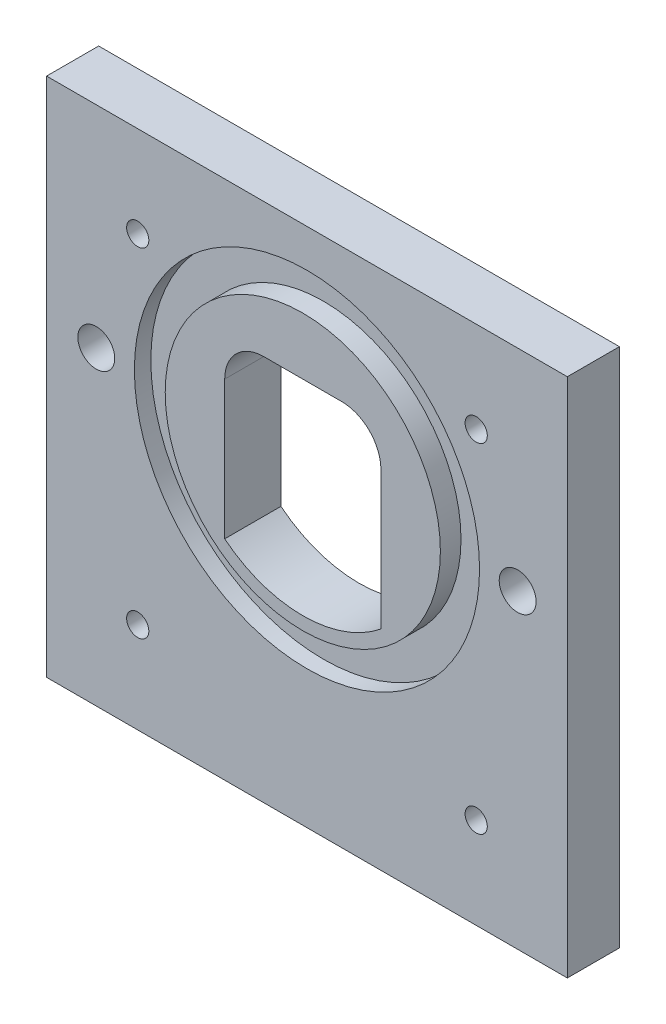
ISO-10303-21;
HEADER;
FILE_DESCRIPTION(('STEP AP214'),'2;1');
FILE_NAME('part.step','',(''),(''),'','','');
FILE_SCHEMA(('AUTOMOTIVE_DESIGN { 1 0 10303 214 1 1 1 1 }'));
ENDSEC;
DATA;
#1=APPLICATION_CONTEXT('core data for automotive mechanical design processes');
#2=APPLICATION_PROTOCOL_DEFINITION('international standard','automotive_design',2000,#1);
#3=PRODUCT_CONTEXT('',#1,'mechanical');
#4=PRODUCT('Part','Part','',(#3));
#5=PRODUCT_RELATED_PRODUCT_CATEGORY('part','',(#4));
#6=PRODUCT_DEFINITION_FORMATION('','',#4);
#7=PRODUCT_DEFINITION_CONTEXT('part definition',#1,'design');
#8=PRODUCT_DEFINITION('design','',#6,#7);
#9=PRODUCT_DEFINITION_SHAPE('','',#8);
#10=(LENGTH_UNIT() NAMED_UNIT(*) SI_UNIT(.MILLI.,.METRE.));
#11=(NAMED_UNIT(*) PLANE_ANGLE_UNIT() SI_UNIT($,.RADIAN.));
#12=(NAMED_UNIT(*) SI_UNIT($,.STERADIAN.) SOLID_ANGLE_UNIT());
#13=UNCERTAINTY_MEASURE_WITH_UNIT(LENGTH_MEASURE(1.E-05),#10,'distance_accuracy_value','');
#14=(GEOMETRIC_REPRESENTATION_CONTEXT(3) GLOBAL_UNCERTAINTY_ASSIGNED_CONTEXT((#13)) GLOBAL_UNIT_ASSIGNED_CONTEXT((#10,
#11,#12)) REPRESENTATION_CONTEXT('',''));
#15=CARTESIAN_POINT('',(0.,0.,0.));
#16=DIRECTION('',(0.,0.,1.));
#17=DIRECTION('',(1.,0.,0.));
#18=AXIS2_PLACEMENT_3D('',#15,#16,#17);
#19=CARTESIAN_POINT('',(31.75,-31.75,6.35));
#20=DIRECTION('',(-1.,0.,0.));
#21=DIRECTION('',(0.,0.,1.));
#22=AXIS2_PLACEMENT_3D('',#19,#20,#21);
#23=PLANE('',#22);
#24=DIRECTION('',(0.,1.,0.));
#25=VECTOR('',#24,1.);
#26=CARTESIAN_POINT('',(31.75,-31.75,0.));
#27=LINE('',#26,#25);
#28=CARTESIAN_POINT('',(31.75,-31.75,0.));
#29=VERTEX_POINT('',#28);
#30=CARTESIAN_POINT('',(31.75,31.75,0.));
#31=VERTEX_POINT('',#30);
#32=EDGE_CURVE('E212',#29,#31,#27,.T.);
#33=ORIENTED_EDGE('',*,*,#32,.T.);
#34=DIRECTION('',(0.,0.,-1.));
#35=VECTOR('',#34,1.);
#36=CARTESIAN_POINT('',(31.75,31.75,6.35));
#37=LINE('',#36,#35);
#38=CARTESIAN_POINT('',(31.75,31.75,6.35));
#39=VERTEX_POINT('',#38);
#40=EDGE_CURVE('E11',#39,#31,#37,.T.);
#41=ORIENTED_EDGE('',*,*,#40,.F.);
#42=DIRECTION('',(0.,1.,0.));
#43=VECTOR('',#42,1.);
#44=CARTESIAN_POINT('',(31.75,-31.75,6.35));
#45=LINE('',#44,#43);
#46=CARTESIAN_POINT('',(31.75,-31.75,6.35));
#47=VERTEX_POINT('',#46);
#48=EDGE_CURVE('E213',#47,#39,#45,.T.);
#49=ORIENTED_EDGE('',*,*,#48,.F.);
#50=DIRECTION('',(0.,0.,-1.));
#51=VECTOR('',#50,1.);
#52=CARTESIAN_POINT('',(31.75,-31.75,6.35));
#53=LINE('',#52,#51);
#54=EDGE_CURVE('E223',#47,#29,#53,.T.);
#55=ORIENTED_EDGE('',*,*,#54,.T.);
#56=EDGE_LOOP('',(#33,#41,#49,#55));
#57=FACE_BOUND('',#56,.T.);
#58=ADVANCED_FACE('F33',(#57),#23,.F.);
#59=CARTESIAN_POINT('',(-31.75,31.75,6.35));
#60=DIRECTION('',(0.,-1.,0.));
#61=DIRECTION('',(0.,0.,-1.));
#62=AXIS2_PLACEMENT_3D('',#59,#60,#61);
#63=PLANE('',#62);
#64=DIRECTION('',(-1.,0.,0.));
#65=VECTOR('',#64,1.);
#66=CARTESIAN_POINT('',(-31.75,31.75,0.));
#67=LINE('',#66,#65);
#68=CARTESIAN_POINT('',(-31.75,31.75,0.));
#69=VERTEX_POINT('',#68);
#70=EDGE_CURVE('E226',#31,#69,#67,.T.);
#71=ORIENTED_EDGE('',*,*,#70,.T.);
#72=DIRECTION('',(0.,0.,-1.));
#73=VECTOR('',#72,1.);
#74=CARTESIAN_POINT('',(-31.75,31.75,6.35));
#75=LINE('',#74,#73);
#76=CARTESIAN_POINT('',(-31.75,31.75,6.35));
#77=VERTEX_POINT('',#76);
#78=EDGE_CURVE('E41',#77,#69,#75,.T.);
#79=ORIENTED_EDGE('',*,*,#78,.F.);
#80=DIRECTION('',(-1.,0.,0.));
#81=VECTOR('',#80,1.);
#82=CARTESIAN_POINT('',(-31.75,31.75,6.35));
#83=LINE('',#82,#81);
#84=EDGE_CURVE('E216',#39,#77,#83,.T.);
#85=ORIENTED_EDGE('',*,*,#84,.F.);
#86=ORIENTED_EDGE('',*,*,#40,.T.);
#87=EDGE_LOOP('',(#71,#79,#85,#86));
#88=FACE_BOUND('',#87,.T.);
#89=ADVANCED_FACE('F258',(#88),#63,.F.);
#90=CARTESIAN_POINT('',(-31.75,-31.75,6.35));
#91=DIRECTION('',(1.,0.,0.));
#92=DIRECTION('',(0.,0.,-1.));
#93=AXIS2_PLACEMENT_3D('',#90,#91,#92);
#94=PLANE('',#93);
#95=DIRECTION('',(0.,-1.,0.));
#96=VECTOR('',#95,1.);
#97=CARTESIAN_POINT('',(-31.75,-31.75,0.));
#98=LINE('',#97,#96);
#99=CARTESIAN_POINT('',(-31.75,-31.75,0.));
#100=VERTEX_POINT('',#99);
#101=EDGE_CURVE('E228',#69,#100,#98,.T.);
#102=ORIENTED_EDGE('',*,*,#101,.T.);
#103=DIRECTION('',(0.,0.,-1.));
#104=VECTOR('',#103,1.);
#105=CARTESIAN_POINT('',(-31.75,-31.75,6.35));
#106=LINE('',#105,#104);
#107=CARTESIAN_POINT('',(-31.75,-31.75,6.35));
#108=VERTEX_POINT('',#107);
#109=EDGE_CURVE('E233',#108,#100,#106,.T.);
#110=ORIENTED_EDGE('',*,*,#109,.F.);
#111=DIRECTION('',(0.,-1.,0.));
#112=VECTOR('',#111,1.);
#113=CARTESIAN_POINT('',(-31.75,-31.75,6.35));
#114=LINE('',#113,#112);
#115=EDGE_CURVE('E219',#77,#108,#114,.T.);
#116=ORIENTED_EDGE('',*,*,#115,.F.);
#117=ORIENTED_EDGE('',*,*,#78,.T.);
#118=EDGE_LOOP('',(#102,#110,#116,#117));
#119=FACE_BOUND('',#118,.T.);
#120=ADVANCED_FACE('F263',(#119),#94,.F.);
#121=CARTESIAN_POINT('',(-31.75,-31.75,6.35));
#122=DIRECTION('',(0.,1.,0.));
#123=DIRECTION('',(0.,0.,1.));
#124=AXIS2_PLACEMENT_3D('',#121,#122,#123);
#125=PLANE('',#124);
#126=DIRECTION('',(1.,0.,0.));
#127=VECTOR('',#126,1.);
#128=CARTESIAN_POINT('',(-31.75,-31.75,0.));
#129=LINE('',#128,#127);
#130=EDGE_CURVE('E217',#100,#29,#129,.T.);
#131=ORIENTED_EDGE('',*,*,#130,.T.);
#132=ORIENTED_EDGE('',*,*,#54,.F.);
#133=DIRECTION('',(1.,0.,0.));
#134=VECTOR('',#133,1.);
#135=CARTESIAN_POINT('',(-31.75,-31.75,6.35));
#136=LINE('',#135,#134);
#137=EDGE_CURVE('E221',#108,#47,#136,.T.);
#138=ORIENTED_EDGE('',*,*,#137,.F.);
#139=ORIENTED_EDGE('',*,*,#109,.T.);
#140=EDGE_LOOP('',(#131,#132,#138,#139));
#141=FACE_BOUND('',#140,.T.);
#142=ADVANCED_FACE('F279',(#141),#125,.F.);
#143=CARTESIAN_POINT('',(31.75,31.75,6.35));
#144=DIRECTION('',(0.,0.,-1.));
#145=DIRECTION('',(-1.,0.,0.));
#146=AXIS2_PLACEMENT_3D('',#143,#144,#145);
#147=PLANE('',#146);
#148=CARTESIAN_POINT('',(25.6911768305445,6.07686515337297,6.35));
#149=DIRECTION('',(0.,0.,-1.));
#150=DIRECTION('',(-1.,0.,0.));
#151=AXIS2_PLACEMENT_3D('',#148,#149,#150);
#152=CIRCLE('',#151,2.25);
#153=CARTESIAN_POINT('',(23.4411768305445,6.07686515337297,6.35));
#154=VERTEX_POINT('',#153);
#155=EDGE_CURVE('E36',#154,#154,#152,.T.);
#156=ORIENTED_EDGE('',*,*,#155,.T.);
#157=EDGE_LOOP('',(#156));
#158=FACE_BOUND('',#157,.T.);
#159=CARTESIAN_POINT('',(-25.6911768305436,6.07686515337297,6.35));
#160=DIRECTION('',(0.,0.,-1.));
#161=DIRECTION('',(-1.,0.,0.));
#162=AXIS2_PLACEMENT_3D('',#159,#160,#161);
#163=CIRCLE('',#162,2.25);
#164=CARTESIAN_POINT('',(-27.9411768305436,6.07686515337297,6.35));
#165=VERTEX_POINT('',#164);
#166=EDGE_CURVE('E175',#165,#165,#163,.T.);
#167=ORIENTED_EDGE('',*,*,#166,.T.);
#168=EDGE_LOOP('',(#167));
#169=FACE_BOUND('',#168,.T.);
#170=CARTESIAN_POINT('',(1.67183974997265E-13,6.07686515337297,6.35));
#171=DIRECTION('',(0.,0.,1.));
#172=DIRECTION('',(1.,0.,0.));
#173=AXIS2_PLACEMENT_3D('',#170,#171,#172);
#174=CIRCLE('',#173,21.0439);
#175=CARTESIAN_POINT('',(21.0439000000002,6.07686515337297,6.35));
#176=VERTEX_POINT('',#175);
#177=EDGE_CURVE('E182',#176,#176,#174,.T.);
#178=ORIENTED_EDGE('',*,*,#177,.F.);
#179=EDGE_LOOP('',(#178));
#180=FACE_BOUND('',#179,.T.);
#181=CARTESIAN_POINT('',(-20.6375,-20.6375,6.35));
#182=DIRECTION('',(0.,0.,-1.));
#183=DIRECTION('',(-1.,0.,0.));
#184=AXIS2_PLACEMENT_3D('',#181,#182,#183);
#185=CIRCLE('',#184,1.35255);
#186=CARTESIAN_POINT('',(-21.99005,-20.6375,6.35));
#187=VERTEX_POINT('',#186);
#188=EDGE_CURVE('E191',#187,#187,#185,.T.);
#189=ORIENTED_EDGE('',*,*,#188,.T.);
#190=EDGE_LOOP('',(#189));
#191=FACE_BOUND('',#190,.T.);
#192=CARTESIAN_POINT('',(20.6375,-20.6375,6.35));
#193=DIRECTION('',(0.,0.,-1.));
#194=DIRECTION('',(-1.,0.,0.));
#195=AXIS2_PLACEMENT_3D('',#192,#193,#194);
#196=CIRCLE('',#195,1.35255);
#197=CARTESIAN_POINT('',(19.28495,-20.6375,6.35));
#198=VERTEX_POINT('',#197);
#199=EDGE_CURVE('E197',#198,#198,#196,.T.);
#200=ORIENTED_EDGE('',*,*,#199,.T.);
#201=EDGE_LOOP('',(#200));
#202=FACE_BOUND('',#201,.T.);
#203=CARTESIAN_POINT('',(20.6375,20.6375,6.35));
#204=DIRECTION('',(0.,0.,-1.));
#205=DIRECTION('',(-1.,0.,0.));
#206=AXIS2_PLACEMENT_3D('',#203,#204,#205);
#207=CIRCLE('',#206,1.35255);
#208=CARTESIAN_POINT('',(19.28495,20.6375,6.35));
#209=VERTEX_POINT('',#208);
#210=EDGE_CURVE('E203',#209,#209,#207,.T.);
#211=ORIENTED_EDGE('',*,*,#210,.T.);
#212=EDGE_LOOP('',(#211));
#213=FACE_BOUND('',#212,.T.);
#214=CARTESIAN_POINT('',(-20.6375,20.6375,6.35));
#215=DIRECTION('',(0.,0.,-1.));
#216=DIRECTION('',(-1.,0.,0.));
#217=AXIS2_PLACEMENT_3D('',#214,#215,#216);
#218=CIRCLE('',#217,1.35255);
#219=CARTESIAN_POINT('',(-21.99005,20.6375,6.35));
#220=VERTEX_POINT('',#219);
#221=EDGE_CURVE('E209',#220,#220,#218,.T.);
#222=ORIENTED_EDGE('',*,*,#221,.T.);
#223=EDGE_LOOP('',(#222));
#224=FACE_BOUND('',#223,.T.);
#225=ORIENTED_EDGE('',*,*,#48,.T.);
#226=ORIENTED_EDGE('',*,*,#84,.T.);
#227=ORIENTED_EDGE('',*,*,#115,.T.);
#228=ORIENTED_EDGE('',*,*,#137,.T.);
#229=EDGE_LOOP('',(#225,#226,#227,#228));
#230=FACE_BOUND('',#229,.T.);
#231=ADVANCED_FACE('F240',(#158,#169,#180,#191,#202,#213,#224,#230),#147,.F.);
#232=CARTESIAN_POINT('',(31.75,31.75,0.));
#233=DIRECTION('',(0.,0.,-1.));
#234=DIRECTION('',(-1.,0.,0.));
#235=AXIS2_PLACEMENT_3D('',#232,#233,#234);
#236=PLANE('',#235);
#237=CARTESIAN_POINT('',(-4.7625,11.1125,0.));
#238=DIRECTION('',(0.,0.,-1.));
#239=DIRECTION('',(-1.,0.,0.));
#240=AXIS2_PLACEMENT_3D('',#237,#238,#239);
#241=CIRCLE('',#240,4.7625);
#242=CARTESIAN_POINT('',(-9.525,11.1125,0.));
#243=VERTEX_POINT('',#242);
#244=CARTESIAN_POINT('',(-4.7625,15.875,0.));
#245=VERTEX_POINT('',#244);
#246=EDGE_CURVE('E49',#243,#245,#241,.T.);
#247=ORIENTED_EDGE('',*,*,#246,.F.);
#248=DIRECTION('',(0.,1.,0.));
#249=VECTOR('',#248,1.);
#250=CARTESIAN_POINT('',(-9.525,11.1125,0.));
#251=LINE('',#250,#249);
#252=CARTESIAN_POINT('',(-9.525,-5.75471004353972,0.));
#253=VERTEX_POINT('',#252);
#254=EDGE_CURVE('E130',#253,#243,#251,.T.);
#255=ORIENTED_EDGE('',*,*,#254,.F.);
#256=CARTESIAN_POINT('',(0.,6.07686515337317,0.));
#257=DIRECTION('',(0.,0.,-1.));
#258=DIRECTION('',(-1.,0.,0.));
#259=AXIS2_PLACEMENT_3D('',#256,#257,#258);
#260=CIRCLE('',#259,15.1892000000067);
#261=CARTESIAN_POINT('',(9.525,-5.75471004353972,0.));
#262=VERTEX_POINT('',#261);
#263=EDGE_CURVE('E133',#262,#253,#260,.T.);
#264=ORIENTED_EDGE('',*,*,#263,.F.);
#265=DIRECTION('',(0.,-1.,0.));
#266=VECTOR('',#265,1.);
#267=CARTESIAN_POINT('',(9.525,11.1125,0.));
#268=LINE('',#267,#266);
#269=CARTESIAN_POINT('',(9.525,11.1125,0.));
#270=VERTEX_POINT('',#269);
#271=EDGE_CURVE('E149',#270,#262,#268,.T.);
#272=ORIENTED_EDGE('',*,*,#271,.F.);
#273=CARTESIAN_POINT('',(4.7625,11.1125,0.));
#274=DIRECTION('',(0.,0.,-1.));
#275=DIRECTION('',(1.,0.,0.));
#276=AXIS2_PLACEMENT_3D('',#273,#274,#275);
#277=CIRCLE('',#276,4.7625);
#278=CARTESIAN_POINT('',(4.7625,15.875,0.));
#279=VERTEX_POINT('',#278);
#280=EDGE_CURVE('E146',#279,#270,#277,.T.);
#281=ORIENTED_EDGE('',*,*,#280,.F.);
#282=DIRECTION('',(1.,0.,0.));
#283=VECTOR('',#282,1.);
#284=CARTESIAN_POINT('',(-4.7625,15.875,0.));
#285=LINE('',#284,#283);
#286=EDGE_CURVE('E144',#245,#279,#285,.T.);
#287=ORIENTED_EDGE('',*,*,#286,.F.);
#288=EDGE_LOOP('',(#247,#255,#264,#272,#281,#287));
#289=FACE_BOUND('',#288,.T.);
#290=CARTESIAN_POINT('',(25.6911768305445,6.07686515337297,0.));
#291=DIRECTION('',(0.,0.,-1.));
#292=DIRECTION('',(-1.,0.,0.));
#293=AXIS2_PLACEMENT_3D('',#290,#291,#292);
#294=CIRCLE('',#293,4.7);
#295=CARTESIAN_POINT('',(20.9911768305445,6.07686515337297,0.));
#296=VERTEX_POINT('',#295);
#297=EDGE_CURVE('E156',#296,#296,#294,.T.);
#298=ORIENTED_EDGE('',*,*,#297,.F.);
#299=EDGE_LOOP('',(#298));
#300=FACE_BOUND('',#299,.T.);
#301=CARTESIAN_POINT('',(-25.6911768305436,6.07686515337297,0.));
#302=DIRECTION('',(0.,0.,-1.));
#303=DIRECTION('',(-1.,0.,0.));
#304=AXIS2_PLACEMENT_3D('',#301,#302,#303);
#305=CIRCLE('',#304,4.7);
#306=CARTESIAN_POINT('',(-30.3911768305436,6.07686515337297,0.));
#307=VERTEX_POINT('',#306);
#308=EDGE_CURVE('E169',#307,#307,#305,.T.);
#309=ORIENTED_EDGE('',*,*,#308,.F.);
#310=EDGE_LOOP('',(#309));
#311=FACE_BOUND('',#310,.T.);
#312=CARTESIAN_POINT('',(-20.6375,-20.6375,0.));
#313=DIRECTION('',(0.,0.,-1.));
#314=DIRECTION('',(-1.,0.,0.));
#315=AXIS2_PLACEMENT_3D('',#312,#313,#314);
#316=CIRCLE('',#315,1.35254999999999);
#317=CARTESIAN_POINT('',(-21.99005,-20.6375,0.));
#318=VERTEX_POINT('',#317);
#319=EDGE_CURVE('E186',#318,#318,#316,.T.);
#320=ORIENTED_EDGE('',*,*,#319,.F.);
#321=EDGE_LOOP('',(#320));
#322=FACE_BOUND('',#321,.T.);
#323=CARTESIAN_POINT('',(20.6375,-20.6375,0.));
#324=DIRECTION('',(0.,0.,-1.));
#325=DIRECTION('',(-1.,0.,0.));
#326=AXIS2_PLACEMENT_3D('',#323,#324,#325);
#327=CIRCLE('',#326,1.35254999999999);
#328=CARTESIAN_POINT('',(19.28495,-20.6375,0.));
#329=VERTEX_POINT('',#328);
#330=EDGE_CURVE('E194',#329,#329,#327,.T.);
#331=ORIENTED_EDGE('',*,*,#330,.F.);
#332=EDGE_LOOP('',(#331));
#333=FACE_BOUND('',#332,.T.);
#334=CARTESIAN_POINT('',(20.6375,20.6375,0.));
#335=DIRECTION('',(0.,0.,-1.));
#336=DIRECTION('',(-1.,0.,0.));
#337=AXIS2_PLACEMENT_3D('',#334,#335,#336);
#338=CIRCLE('',#337,1.35254999999999);
#339=CARTESIAN_POINT('',(19.28495,20.6375,0.));
#340=VERTEX_POINT('',#339);
#341=EDGE_CURVE('E200',#340,#340,#338,.T.);
#342=ORIENTED_EDGE('',*,*,#341,.F.);
#343=EDGE_LOOP('',(#342));
#344=FACE_BOUND('',#343,.T.);
#345=CARTESIAN_POINT('',(-20.6375,20.6375,0.));
#346=DIRECTION('',(0.,0.,-1.));
#347=DIRECTION('',(-1.,0.,0.));
#348=AXIS2_PLACEMENT_3D('',#345,#346,#347);
#349=CIRCLE('',#348,1.35254999999999);
#350=CARTESIAN_POINT('',(-21.99005,20.6375,0.));
#351=VERTEX_POINT('',#350);
#352=EDGE_CURVE('E206',#351,#351,#349,.T.);
#353=ORIENTED_EDGE('',*,*,#352,.F.);
#354=EDGE_LOOP('',(#353));
#355=FACE_BOUND('',#354,.T.);
#356=ORIENTED_EDGE('',*,*,#32,.F.);
#357=ORIENTED_EDGE('',*,*,#130,.F.);
#358=ORIENTED_EDGE('',*,*,#101,.F.);
#359=ORIENTED_EDGE('',*,*,#70,.F.);
#360=EDGE_LOOP('',(#356,#357,#358,#359));
#361=FACE_BOUND('',#360,.T.);
#362=ADVANCED_FACE('F271',(#289,#300,#311,#322,#333,#344,#355,#361),#236,.T.);
#363=CARTESIAN_POINT('',(-20.6375,20.6375,0.));
#364=DIRECTION('',(0.,0.,-1.));
#365=DIRECTION('',(-1.,0.,0.));
#366=AXIS2_PLACEMENT_3D('',#363,#364,#365);
#367=CYLINDRICAL_SURFACE('',#366,1.35254999999999);
#368=ORIENTED_EDGE('',*,*,#221,.F.);
#369=EDGE_LOOP('',(#368));
#370=FACE_BOUND('',#369,.T.);
#371=ORIENTED_EDGE('',*,*,#352,.T.);
#372=EDGE_LOOP('',(#371));
#373=FACE_BOUND('',#372,.T.);
#374=ADVANCED_FACE('F290',(#370,#373),#367,.F.);
#375=CARTESIAN_POINT('',(20.6375,20.6375,0.));
#376=DIRECTION('',(0.,0.,-1.));
#377=DIRECTION('',(-1.,0.,0.));
#378=AXIS2_PLACEMENT_3D('',#375,#376,#377);
#379=CYLINDRICAL_SURFACE('',#378,1.35254999999999);
#380=ORIENTED_EDGE('',*,*,#210,.F.);
#381=EDGE_LOOP('',(#380));
#382=FACE_BOUND('',#381,.T.);
#383=ORIENTED_EDGE('',*,*,#341,.T.);
#384=EDGE_LOOP('',(#383));
#385=FACE_BOUND('',#384,.T.);
#386=ADVANCED_FACE('F297',(#382,#385),#379,.F.);
#387=CARTESIAN_POINT('',(20.6375,-20.6375,0.));
#388=DIRECTION('',(0.,0.,-1.));
#389=DIRECTION('',(-1.,0.,0.));
#390=AXIS2_PLACEMENT_3D('',#387,#388,#389);
#391=CYLINDRICAL_SURFACE('',#390,1.35254999999999);
#392=ORIENTED_EDGE('',*,*,#199,.F.);
#393=EDGE_LOOP('',(#392));
#394=FACE_BOUND('',#393,.T.);
#395=ORIENTED_EDGE('',*,*,#330,.T.);
#396=EDGE_LOOP('',(#395));
#397=FACE_BOUND('',#396,.T.);
#398=ADVANCED_FACE('F301',(#394,#397),#391,.F.);
#399=CARTESIAN_POINT('',(-20.6375,-20.6375,0.));
#400=DIRECTION('',(0.,0.,-1.));
#401=DIRECTION('',(-1.,0.,0.));
#402=AXIS2_PLACEMENT_3D('',#399,#400,#401);
#403=CYLINDRICAL_SURFACE('',#402,1.35254999999999);
#404=ORIENTED_EDGE('',*,*,#188,.F.);
#405=EDGE_LOOP('',(#404));
#406=FACE_BOUND('',#405,.T.);
#407=ORIENTED_EDGE('',*,*,#319,.T.);
#408=EDGE_LOOP('',(#407));
#409=FACE_BOUND('',#408,.T.);
#410=ADVANCED_FACE('F305',(#406,#409),#403,.F.);
#411=CARTESIAN_POINT('',(1.67183974997265E-13,6.07686515337297,4.3434));
#412=DIRECTION('',(0.,0.,1.));
#413=DIRECTION('',(1.,0.,0.));
#414=AXIS2_PLACEMENT_3D('',#411,#412,#413);
#415=CYLINDRICAL_SURFACE('',#414,21.0439);
#416=CARTESIAN_POINT('',(1.67183974997265E-13,6.07686515337297,4.3434));
#417=DIRECTION('',(0.,0.,1.));
#418=DIRECTION('',(1.,0.,0.));
#419=AXIS2_PLACEMENT_3D('',#416,#417,#418);
#420=CIRCLE('',#419,21.0439);
#421=CARTESIAN_POINT('',(21.0439000000002,6.07686515337297,4.3434));
#422=VERTEX_POINT('',#421);
#423=EDGE_CURVE('E183',#422,#422,#420,.T.);
#424=ORIENTED_EDGE('',*,*,#423,.F.);
#425=EDGE_LOOP('',(#424));
#426=FACE_BOUND('',#425,.T.);
#427=ORIENTED_EDGE('',*,*,#177,.T.);
#428=EDGE_LOOP('',(#427));
#429=FACE_BOUND('',#428,.T.);
#430=ADVANCED_FACE('F309',(#426,#429),#415,.F.);
#431=CARTESIAN_POINT('',(1.67183974997265E-13,6.07686515337297,4.3434));
#432=DIRECTION('',(0.,0.,1.));
#433=DIRECTION('',(1.,0.,0.));
#434=AXIS2_PLACEMENT_3D('',#431,#432,#433);
#435=PLANE('',#434);
#436=CARTESIAN_POINT('',(1.67183974997265E-13,6.07686515337297,4.3434));
#437=DIRECTION('',(0.,0.,1.));
#438=DIRECTION('',(1.,0.,0.));
#439=AXIS2_PLACEMENT_3D('',#436,#437,#438);
#440=CIRCLE('',#439,16.7767);
#441=CARTESIAN_POINT('',(16.7767000000002,6.07686515337297,4.3434));
#442=VERTEX_POINT('',#441);
#443=EDGE_CURVE('E179',#442,#442,#440,.T.);
#444=ORIENTED_EDGE('',*,*,#443,.F.);
#445=EDGE_LOOP('',(#444));
#446=FACE_BOUND('',#445,.T.);
#447=ORIENTED_EDGE('',*,*,#423,.T.);
#448=EDGE_LOOP('',(#447));
#449=FACE_BOUND('',#448,.T.);
#450=ADVANCED_FACE('F313',(#446,#449),#435,.T.);
#451=CARTESIAN_POINT('',(1.67183974997265E-13,6.07686515337297,4.3434));
#452=DIRECTION('',(0.,0.,1.));
#453=DIRECTION('',(1.,0.,0.));
#454=AXIS2_PLACEMENT_3D('',#451,#452,#453);
#455=CYLINDRICAL_SURFACE('',#454,16.7767);
#456=ORIENTED_EDGE('',*,*,#443,.T.);
#457=EDGE_LOOP('',(#456));
#458=FACE_BOUND('',#457,.T.);
#459=CARTESIAN_POINT('',(1.67183974997265E-13,6.07686515337297,6.858));
#460=DIRECTION('',(0.,0.,1.));
#461=DIRECTION('',(1.,0.,0.));
#462=AXIS2_PLACEMENT_3D('',#459,#460,#461);
#463=CIRCLE('',#462,16.7767000000067);
#464=CARTESIAN_POINT('',(16.7767000000068,6.07686515337297,6.858));
#465=VERTEX_POINT('',#464);
#466=EDGE_CURVE('E176',#465,#465,#463,.T.);
#467=ORIENTED_EDGE('',*,*,#466,.F.);
#468=EDGE_LOOP('',(#467));
#469=FACE_BOUND('',#468,.T.);
#470=ADVANCED_FACE('F255',(#458,#469),#455,.T.);
#471=CARTESIAN_POINT('',(1.67183974997265E-13,6.07686515337297,6.858));
#472=DIRECTION('',(0.,0.,1.));
#473=DIRECTION('',(1.,0.,0.));
#474=AXIS2_PLACEMENT_3D('',#471,#472,#473);
#475=PLANE('',#474);
#476=CARTESIAN_POINT('',(-4.7625,11.1125,6.858));
#477=DIRECTION('',(0.,0.,-1.));
#478=DIRECTION('',(-1.,0.,0.));
#479=AXIS2_PLACEMENT_3D('',#476,#477,#478);
#480=CIRCLE('',#479,4.7625);
#481=CARTESIAN_POINT('',(-9.525,11.1125,6.858));
#482=VERTEX_POINT('',#481);
#483=CARTESIAN_POINT('',(-4.7625,15.875,6.858));
#484=VERTEX_POINT('',#483);
#485=EDGE_CURVE('E113',#482,#484,#480,.T.);
#486=ORIENTED_EDGE('',*,*,#485,.T.);
#487=DIRECTION('',(1.,0.,0.));
#488=VECTOR('',#487,1.);
#489=CARTESIAN_POINT('',(-4.7625,15.875,6.858));
#490=LINE('',#489,#488);
#491=CARTESIAN_POINT('',(4.7625,15.875,6.858));
#492=VERTEX_POINT('',#491);
#493=EDGE_CURVE('E122',#484,#492,#490,.T.);
#494=ORIENTED_EDGE('',*,*,#493,.T.);
#495=CARTESIAN_POINT('',(4.7625,11.1125,6.858));
#496=DIRECTION('',(0.,0.,-1.));
#497=DIRECTION('',(1.,0.,0.));
#498=AXIS2_PLACEMENT_3D('',#495,#496,#497);
#499=CIRCLE('',#498,4.7625);
#500=CARTESIAN_POINT('',(9.525,11.1125,6.858));
#501=VERTEX_POINT('',#500);
#502=EDGE_CURVE('E57',#492,#501,#499,.T.);
#503=ORIENTED_EDGE('',*,*,#502,.T.);
#504=DIRECTION('',(0.,-1.,0.));
#505=VECTOR('',#504,1.);
#506=CARTESIAN_POINT('',(9.525,11.1125,6.858));
#507=LINE('',#506,#505);
#508=CARTESIAN_POINT('',(9.525,-5.75471004353972,6.858));
#509=VERTEX_POINT('',#508);
#510=EDGE_CURVE('E137',#501,#509,#507,.T.);
#511=ORIENTED_EDGE('',*,*,#510,.T.);
#512=CARTESIAN_POINT('',(0.,6.07686515337317,6.858));
#513=DIRECTION('',(0.,0.,-1.));
#514=DIRECTION('',(-1.,0.,0.));
#515=AXIS2_PLACEMENT_3D('',#512,#513,#514);
#516=CIRCLE('',#515,15.1892000000067);
#517=CARTESIAN_POINT('',(-9.525,-5.75471004353972,6.858));
#518=VERTEX_POINT('',#517);
#519=EDGE_CURVE('E140',#509,#518,#516,.T.);
#520=ORIENTED_EDGE('',*,*,#519,.T.);
#521=DIRECTION('',(0.,1.,0.));
#522=VECTOR('',#521,1.);
#523=CARTESIAN_POINT('',(-9.525,11.1125,6.858));
#524=LINE('',#523,#522);
#525=EDGE_CURVE('E119',#518,#482,#524,.T.);
#526=ORIENTED_EDGE('',*,*,#525,.T.);
#527=EDGE_LOOP('',(#486,#494,#503,#511,#520,#526));
#528=FACE_BOUND('',#527,.T.);
#529=ORIENTED_EDGE('',*,*,#466,.T.);
#530=EDGE_LOOP('',(#529));
#531=FACE_BOUND('',#530,.T.);
#532=ADVANCED_FACE('F126',(#528,#531),#475,.T.);
#533=CARTESIAN_POINT('',(-25.6911768305436,6.07686515337297,0.));
#534=DIRECTION('',(0.,0.,-1.));
#535=DIRECTION('',(-1.,0.,0.));
#536=AXIS2_PLACEMENT_3D('',#533,#534,#535);
#537=CYLINDRICAL_SURFACE('',#536,2.25);
#538=CARTESIAN_POINT('',(-25.6911768305436,6.07686515337297,2.45));
#539=DIRECTION('',(0.,0.,-1.));
#540=DIRECTION('',(-1.,0.,0.));
#541=AXIS2_PLACEMENT_3D('',#538,#539,#540);
#542=CIRCLE('',#541,2.25);
#543=CARTESIAN_POINT('',(-27.9411768305436,6.07686515337297,2.45));
#544=VERTEX_POINT('',#543);
#545=EDGE_CURVE('E172',#544,#544,#542,.T.);
#546=ORIENTED_EDGE('',*,*,#545,.T.);
#547=EDGE_LOOP('',(#546));
#548=FACE_BOUND('',#547,.T.);
#549=ORIENTED_EDGE('',*,*,#166,.F.);
#550=EDGE_LOOP('',(#549));
#551=FACE_BOUND('',#550,.T.);
#552=ADVANCED_FACE('F243',(#548,#551),#537,.F.);
#553=CARTESIAN_POINT('',(-25.6911768305436,6.07686515337297,0.));
#554=DIRECTION('',(0.,0.,-1.));
#555=DIRECTION('',(-1.,0.,0.));
#556=AXIS2_PLACEMENT_3D('',#553,#554,#555);
#557=CONICAL_SURFACE('',#556,4.7,0.785398163397448);
#558=ORIENTED_EDGE('',*,*,#545,.F.);
#559=EDGE_LOOP('',(#558));
#560=FACE_BOUND('',#559,.T.);
#561=ORIENTED_EDGE('',*,*,#308,.T.);
#562=EDGE_LOOP('',(#561));
#563=FACE_BOUND('',#562,.T.);
#564=ADVANCED_FACE('F245',(#560,#563),#557,.F.);
#565=CARTESIAN_POINT('',(25.6911768305445,6.07686515337297,0.));
#566=DIRECTION('',(0.,0.,-1.));
#567=DIRECTION('',(-1.,0.,0.));
#568=AXIS2_PLACEMENT_3D('',#565,#566,#567);
#569=CYLINDRICAL_SURFACE('',#568,2.25);
#570=CARTESIAN_POINT('',(25.6911768305445,6.07686515337297,2.45));
#571=DIRECTION('',(0.,0.,-1.));
#572=DIRECTION('',(-1.,0.,0.));
#573=AXIS2_PLACEMENT_3D('',#570,#571,#572);
#574=CIRCLE('',#573,2.25);
#575=CARTESIAN_POINT('',(23.4411768305445,6.07686515337297,2.45));
#576=VERTEX_POINT('',#575);
#577=EDGE_CURVE('E166',#576,#576,#574,.T.);
#578=ORIENTED_EDGE('',*,*,#577,.T.);
#579=EDGE_LOOP('',(#578));
#580=FACE_BOUND('',#579,.T.);
#581=ORIENTED_EDGE('',*,*,#155,.F.);
#582=EDGE_LOOP('',(#581));
#583=FACE_BOUND('',#582,.T.);
#584=ADVANCED_FACE('F252',(#580,#583),#569,.F.);
#585=CARTESIAN_POINT('',(25.6911768305445,6.07686515337297,0.));
#586=DIRECTION('',(0.,0.,-1.));
#587=DIRECTION('',(-1.,0.,0.));
#588=AXIS2_PLACEMENT_3D('',#585,#586,#587);
#589=CONICAL_SURFACE('',#588,4.7,0.785398163397448);
#590=ORIENTED_EDGE('',*,*,#577,.F.);
#591=EDGE_LOOP('',(#590));
#592=FACE_BOUND('',#591,.T.);
#593=ORIENTED_EDGE('',*,*,#297,.T.);
#594=EDGE_LOOP('',(#593));
#595=FACE_BOUND('',#594,.T.);
#596=ADVANCED_FACE('F369',(#592,#595),#589,.F.);
#597=CARTESIAN_POINT('',(-4.7625,11.1125,6.858));
#598=DIRECTION('',(0.,0.,-1.));
#599=DIRECTION('',(-1.,0.,0.));
#600=AXIS2_PLACEMENT_3D('',#597,#598,#599);
#601=CYLINDRICAL_SURFACE('',#600,4.7625);
#602=ORIENTED_EDGE('',*,*,#246,.T.);
#603=DIRECTION('',(0.,0.,-1.));
#604=VECTOR('',#603,1.);
#605=CARTESIAN_POINT('',(-4.7625,15.875,6.858));
#606=LINE('',#605,#604);
#607=EDGE_CURVE('E109',#484,#245,#606,.T.);
#608=ORIENTED_EDGE('',*,*,#607,.F.);
#609=ORIENTED_EDGE('',*,*,#485,.F.);
#610=DIRECTION('',(0.,0.,-1.));
#611=VECTOR('',#610,1.);
#612=CARTESIAN_POINT('',(-9.525,11.1125,6.858));
#613=LINE('',#612,#611);
#614=EDGE_CURVE('E154',#482,#243,#613,.T.);
#615=ORIENTED_EDGE('',*,*,#614,.T.);
#616=EDGE_LOOP('',(#602,#608,#609,#615));
#617=FACE_BOUND('',#616,.T.);
#618=ADVANCED_FACE('F111',(#617),#601,.F.);
#619=CARTESIAN_POINT('',(-9.525,11.1125,6.858));
#620=DIRECTION('',(-1.,0.,0.));
#621=DIRECTION('',(0.,-1.,0.));
#622=AXIS2_PLACEMENT_3D('',#619,#620,#621);
#623=PLANE('',#622);
#624=ORIENTED_EDGE('',*,*,#254,.T.);
#625=ORIENTED_EDGE('',*,*,#614,.F.);
#626=ORIENTED_EDGE('',*,*,#525,.F.);
#627=DIRECTION('',(0.,0.,-1.));
#628=VECTOR('',#627,1.);
#629=CARTESIAN_POINT('',(-9.525,-5.75471004353972,6.858));
#630=LINE('',#629,#628);
#631=EDGE_CURVE('E157',#518,#253,#630,.T.);
#632=ORIENTED_EDGE('',*,*,#631,.T.);
#633=EDGE_LOOP('',(#624,#625,#626,#632));
#634=FACE_BOUND('',#633,.T.);
#635=ADVANCED_FACE('F368',(#634),#623,.F.);
#636=CARTESIAN_POINT('',(0.,6.07686515337317,6.858));
#637=DIRECTION('',(0.,0.,-1.));
#638=DIRECTION('',(-1.,0.,0.));
#639=AXIS2_PLACEMENT_3D('',#636,#637,#638);
#640=CYLINDRICAL_SURFACE('',#639,15.1892000000067);
#641=ORIENTED_EDGE('',*,*,#263,.T.);
#642=ORIENTED_EDGE('',*,*,#631,.F.);
#643=ORIENTED_EDGE('',*,*,#519,.F.);
#644=DIRECTION('',(0.,0.,-1.));
#645=VECTOR('',#644,1.);
#646=CARTESIAN_POINT('',(9.525,-5.75471004353972,6.858));
#647=LINE('',#646,#645);
#648=EDGE_CURVE('E159',#509,#262,#647,.T.);
#649=ORIENTED_EDGE('',*,*,#648,.T.);
#650=EDGE_LOOP('',(#641,#642,#643,#649));
#651=FACE_BOUND('',#650,.T.);
#652=ADVANCED_FACE('F380',(#651),#640,.F.);
#653=CARTESIAN_POINT('',(9.525,11.1125,6.858));
#654=DIRECTION('',(1.,0.,0.));
#655=DIRECTION('',(0.,1.,0.));
#656=AXIS2_PLACEMENT_3D('',#653,#654,#655);
#657=PLANE('',#656);
#658=ORIENTED_EDGE('',*,*,#271,.T.);
#659=ORIENTED_EDGE('',*,*,#648,.F.);
#660=ORIENTED_EDGE('',*,*,#510,.F.);
#661=DIRECTION('',(0.,0.,-1.));
#662=VECTOR('',#661,1.);
#663=CARTESIAN_POINT('',(9.525,11.1125,6.858));
#664=LINE('',#663,#662);
#665=EDGE_CURVE('E161',#501,#270,#664,.T.);
#666=ORIENTED_EDGE('',*,*,#665,.T.);
#667=EDGE_LOOP('',(#658,#659,#660,#666));
#668=FACE_BOUND('',#667,.T.);
#669=ADVANCED_FACE('F390',(#668),#657,.F.);
#670=CARTESIAN_POINT('',(4.7625,11.1125,6.858));
#671=DIRECTION('',(0.,0.,-1.));
#672=DIRECTION('',(-1.,0.,0.));
#673=AXIS2_PLACEMENT_3D('',#670,#671,#672);
#674=CYLINDRICAL_SURFACE('',#673,4.7625);
#675=ORIENTED_EDGE('',*,*,#280,.T.);
#676=ORIENTED_EDGE('',*,*,#665,.F.);
#677=ORIENTED_EDGE('',*,*,#502,.F.);
#678=DIRECTION('',(0.,0.,-1.));
#679=VECTOR('',#678,1.);
#680=CARTESIAN_POINT('',(4.7625,15.875,6.858));
#681=LINE('',#680,#679);
#682=EDGE_CURVE('E118',#492,#279,#681,.T.);
#683=ORIENTED_EDGE('',*,*,#682,.T.);
#684=EDGE_LOOP('',(#675,#676,#677,#683));
#685=FACE_BOUND('',#684,.T.);
#686=ADVANCED_FACE('F400',(#685),#674,.F.);
#687=CARTESIAN_POINT('',(-4.7625,15.875,6.858));
#688=DIRECTION('',(0.,1.,0.));
#689=DIRECTION('',(0.,0.,1.));
#690=AXIS2_PLACEMENT_3D('',#687,#688,#689);
#691=PLANE('',#690);
#692=ORIENTED_EDGE('',*,*,#286,.T.);
#693=ORIENTED_EDGE('',*,*,#682,.F.);
#694=ORIENTED_EDGE('',*,*,#493,.F.);
#695=ORIENTED_EDGE('',*,*,#607,.T.);
#696=EDGE_LOOP('',(#692,#693,#694,#695));
#697=FACE_BOUND('',#696,.T.);
#698=ADVANCED_FACE('F123',(#697),#691,.F.);
#699=CLOSED_SHELL('',(#58,#89,#120,#142,#231,#362,#374,#386,#398,#410,#430,#450,#470,#532,#552,
#564,#584,#596,#618,#635,#652,#669,#686,#698));
#700=MANIFOLD_SOLID_BREP('B2',#699);
#701=ADVANCED_BREP_SHAPE_REPRESENTATION('',(#18,#700),#14);
#702=SHAPE_DEFINITION_REPRESENTATION(#9,#701);
ENDSEC;
END-ISO-10303-21;
